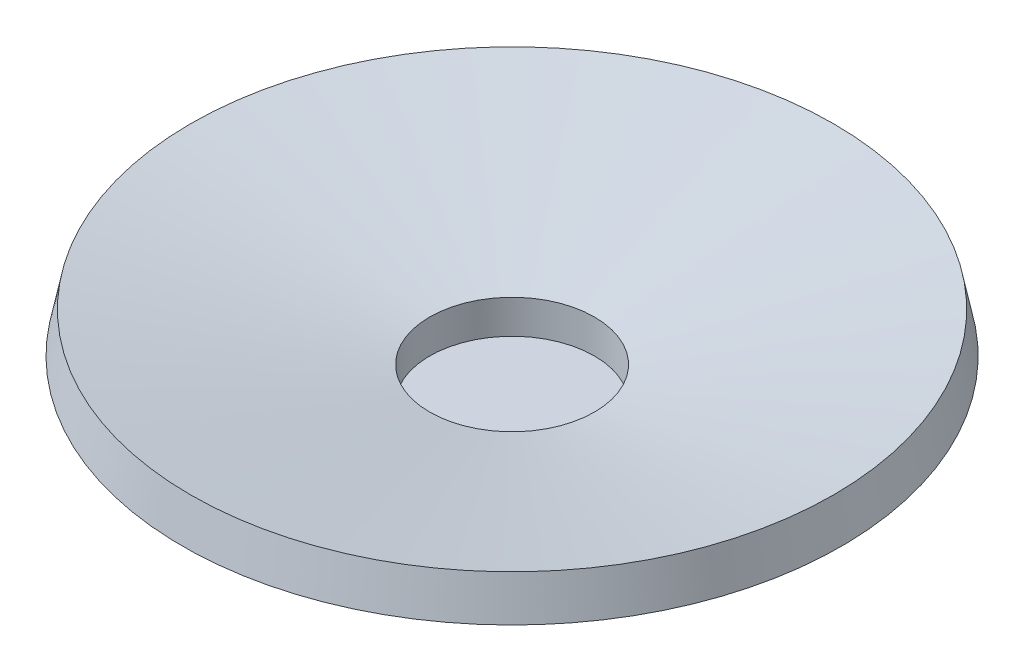
ISO-10303-21;
HEADER;
FILE_DESCRIPTION(('STEP AP214'),'2;1');
FILE_NAME('part.step','',(''),(''),'','','');
FILE_SCHEMA(('AUTOMOTIVE_DESIGN { 1 0 10303 214 1 1 1 1 }'));
ENDSEC;
DATA;
#1=APPLICATION_CONTEXT('core data for automotive mechanical design processes');
#2=APPLICATION_PROTOCOL_DEFINITION('international standard','automotive_design',2000,#1);
#3=PRODUCT_CONTEXT('',#1,'mechanical');
#4=PRODUCT('Part','Part','',(#3));
#5=PRODUCT_RELATED_PRODUCT_CATEGORY('part','',(#4));
#6=PRODUCT_DEFINITION_FORMATION('','',#4);
#7=PRODUCT_DEFINITION_CONTEXT('part definition',#1,'design');
#8=PRODUCT_DEFINITION('design','',#6,#7);
#9=PRODUCT_DEFINITION_SHAPE('','',#8);
#10=(LENGTH_UNIT() NAMED_UNIT(*) SI_UNIT(.MILLI.,.METRE.));
#11=(NAMED_UNIT(*) PLANE_ANGLE_UNIT() SI_UNIT($,.RADIAN.));
#12=(NAMED_UNIT(*) SI_UNIT($,.STERADIAN.) SOLID_ANGLE_UNIT());
#13=UNCERTAINTY_MEASURE_WITH_UNIT(LENGTH_MEASURE(1.E-05),#10,'distance_accuracy_value','');
#14=(GEOMETRIC_REPRESENTATION_CONTEXT(3) GLOBAL_UNCERTAINTY_ASSIGNED_CONTEXT((#13)) GLOBAL_UNIT_ASSIGNED_CONTEXT((#10,
#11,#12)) REPRESENTATION_CONTEXT('',''));
#15=CARTESIAN_POINT('',(0.,0.,0.));
#16=DIRECTION('',(0.,0.,1.));
#17=DIRECTION('',(1.,0.,0.));
#18=AXIS2_PLACEMENT_3D('',#15,#16,#17);
#19=CARTESIAN_POINT('',(0.,18.1980390271856,0.));
#20=DIRECTION('',(0.,1.,0.));
#21=DIRECTION('',(0.,0.,1.));
#22=AXIS2_PLACEMENT_3D('',#19,#20,#21);
#23=CONICAL_SURFACE('',#22,20.,1.37340076694502);
#24=CARTESIAN_POINT('',(0.,29.8058067569092,0.));
#25=DIRECTION('',(0.,-1.,0.));
#26=DIRECTION('',(0.,0.,-1.));
#27=AXIS2_PLACEMENT_3D('',#24,#25,#26);
#28=CIRCLE('',#27,78.0388386486182);
#29=CARTESIAN_POINT('',(0.,29.8058067569092,78.0388386486182));
#30=VERTEX_POINT('',#29);
#31=EDGE_CURVE('E58',#30,#30,#28,.T.);
#32=CARTESIAN_POINT('',(0.,18.1980390271856,0.));
#33=DIRECTION('',(0.,-1.,0.));
#34=DIRECTION('',(0.,0.,-1.));
#35=AXIS2_PLACEMENT_3D('',#32,#33,#34);
#36=CIRCLE('',#35,20.);
#37=CARTESIAN_POINT('',(0.,18.1980390271856,20.));
#38=VERTEX_POINT('',#37);
#39=EDGE_CURVE('E10',#38,#38,#36,.T.);
#40=CARTESIAN_POINT('',(0.,29.8058067569092,78.0388386486182));
#41=CARTESIAN_POINT('',(0.,29.6848925097246,77.4342674126951));
#42=CARTESIAN_POINT('',(0.,29.56397826254,76.829696176772));
#43=CARTESIAN_POINT('',(0.,29.3221497681707,75.6205537049258));
#44=CARTESIAN_POINT('',(0.,29.2012355209861,75.0159824690027));
#45=CARTESIAN_POINT('',(0.,28.9594070266169,73.8068399971565));
#46=CARTESIAN_POINT('',(0.,28.8384927794322,73.2022687612334));
#47=CARTESIAN_POINT('',(0.,28.596664285063,71.9931262893871));
#48=CARTESIAN_POINT('',(0.,28.4757500378784,71.388555053464));
#49=CARTESIAN_POINT('',(0.,28.2339215435091,70.1794125816178));
#50=CARTESIAN_POINT('',(0.,28.1130072963245,69.5748413456947));
#51=CARTESIAN_POINT('',(0.,27.8711788019553,68.3656988738485));
#52=CARTESIAN_POINT('',(0.,27.7502645547706,67.7611276379254));
#53=CARTESIAN_POINT('',(0.,27.5084360604014,66.5519851660792));
#54=CARTESIAN_POINT('',(0.,27.3875218132168,65.9474139301561));
#55=CARTESIAN_POINT('',(0.,27.1456933188475,64.7382714583099));
#56=CARTESIAN_POINT('',(0.,27.0247790716629,64.1337002223868));
#57=CARTESIAN_POINT('',(0.,26.7829505772937,62.9245577505405));
#58=CARTESIAN_POINT('',(0.,26.6620363301091,62.3199865146174));
#59=CARTESIAN_POINT('',(0.,26.4202078357398,61.1108440427712));
#60=CARTESIAN_POINT('',(0.,26.2992935885552,60.5062728068481));
#61=CARTESIAN_POINT('',(0.,26.057465094186,59.2971303350019));
#62=CARTESIAN_POINT('',(0.,25.9365508470013,58.6925590990788));
#63=CARTESIAN_POINT('',(0.,25.6947223526321,57.4834166272326));
#64=CARTESIAN_POINT('',(0.,25.5738081054475,56.8788453913095));
#65=CARTESIAN_POINT('',(0.,25.3319796110782,55.6697029194633));
#66=CARTESIAN_POINT('',(0.,25.2110653638936,55.0651316835402));
#67=CARTESIAN_POINT('',(0.,24.9692368695244,53.855989211694));
#68=CARTESIAN_POINT('',(0.,24.8483226223397,53.2514179757708));
#69=CARTESIAN_POINT('',(0.,24.6064941279705,52.0422755039246));
#70=CARTESIAN_POINT('',(0.,24.4855798807859,51.4377042680015));
#71=CARTESIAN_POINT('',(0.,24.2437513864166,50.2285617961553));
#72=CARTESIAN_POINT('',(0.,24.122837139232,49.6239905602322));
#73=CARTESIAN_POINT('',(0.,23.8810086448628,48.414848088386));
#74=CARTESIAN_POINT('',(0.,23.7600943976782,47.8102768524629));
#75=CARTESIAN_POINT('',(0.,23.5182659033089,46.6011343806167));
#76=CARTESIAN_POINT('',(0.,23.3973516561243,45.9965631446936));
#77=CARTESIAN_POINT('',(0.,23.155523161755,44.7874206728474));
#78=CARTESIAN_POINT('',(0.,23.0346089145704,44.1828494369243));
#79=CARTESIAN_POINT('',(0.,22.7927804202012,42.973706965078));
#80=CARTESIAN_POINT('',(0.,22.6718661730166,42.3691357291549));
#81=CARTESIAN_POINT('',(0.,22.4300376786473,41.1599932573087));
#82=CARTESIAN_POINT('',(0.,22.3091234314627,40.5554220213856));
#83=CARTESIAN_POINT('',(0.,22.0672949370935,39.3462795495394));
#84=CARTESIAN_POINT('',(0.,21.9463806899088,38.7417083136163));
#85=CARTESIAN_POINT('',(0.,21.7045521955396,37.5325658417701));
#86=CARTESIAN_POINT('',(0.,21.583637948355,36.927994605847));
#87=CARTESIAN_POINT('',(0.,21.3418094539857,35.7188521340008));
#88=CARTESIAN_POINT('',(0.,21.2208952068011,35.1142808980777));
#89=CARTESIAN_POINT('',(0.,20.9790667124319,33.9051384262314));
#90=CARTESIAN_POINT('',(0.,20.8581524652472,33.3005671903083));
#91=CARTESIAN_POINT('',(0.,20.616323970878,32.0914247184621));
#92=CARTESIAN_POINT('',(0.,20.4954097236934,31.486853482539));
#93=CARTESIAN_POINT('',(0.,20.2535812293241,30.2777110106928));
#94=CARTESIAN_POINT('',(0.,20.1326669821395,29.6731397747697));
#95=CARTESIAN_POINT('',(0.,19.8908384877703,28.4639973029235));
#96=CARTESIAN_POINT('',(0.,19.7699242405857,27.8594260670004));
#97=CARTESIAN_POINT('',(0.,19.5280957462164,26.6502835951542));
#98=CARTESIAN_POINT('',(0.,19.4071814990318,26.0457123592311));
#99=CARTESIAN_POINT('',(0.,19.1653530046625,24.8365698873849));
#100=CARTESIAN_POINT('',(0.,19.0444387574779,24.2319986514618));
#101=CARTESIAN_POINT('',(0.,18.8026102631087,23.0228561796155));
#102=CARTESIAN_POINT('',(0.,18.6816960159241,22.4182849436924));
#103=CARTESIAN_POINT('',(0.,18.4398675215548,21.2091424718462));
#104=CARTESIAN_POINT('',(0.,18.3189532743702,20.6045712359231));
#105=CARTESIAN_POINT('',(0.,18.1980390271856,20.));
#106=B_SPLINE_CURVE_WITH_KNOTS('',3,(#40,#41,#42,#43,#44,#45,#46,#47,#48,#49,#50,#51,#52,#53,
#54,#55,#56,#57,#58,#59,#60,#61,#62,#63,#64,#65,#66,#67,#68,#69,#70,#71,#72,#73,#74,#75,#76,#77,
#78,#79,#80,#81,#82,#83,#84,#85,#86,#87,#88,#89,#90,#91,#92,#93,#94,#95,#96,#97,#98,#99,#100,
#101,#102,#103,#104,#105),.UNSPECIFIED.,.F.,.F.,(4,2,2,2,2,2,2,2,2,2,2,2,2,2,2,2,2,2,2,2,2,2,2,
2,2,2,2,2,2,2,2,2,4),(0.,1.8496323175973,3.69926463519459,5.54889695279189,7.39852927038917,
9.24816158798648,11.0977939055838,12.9474262231811,14.7970585407784,16.6466908583757,
18.496323175973,20.3459554935703,22.1955878111675,24.0452201287648,25.8948524463621,
27.7444847639594,29.5941170815567,31.443749399154,33.2933817167513,35.1430140343486,
36.9926463519459,38.8422786695432,40.6919109871405,42.5415433047378,44.3911756223351,
46.2408079399324,48.0904402575297,49.940072575127,51.7897048927243,53.6393372103216,
55.4889695279189,57.3386018455161,59.1882341631134),.UNSPECIFIED.);
#107=EDGE_CURVE('BSEAM36',#30,#38,#106,.T.);
#108=ORIENTED_EDGE('',*,*,#31,.F.);
#109=ORIENTED_EDGE('',*,*,#39,.T.);
#110=ORIENTED_EDGE('',*,*,#107,.T.);
#111=ORIENTED_EDGE('',*,*,#107,.F.);
#112=EDGE_LOOP('',(#108,#110,#109,#111));
#113=FACE_BOUND('',#112,.T.);
#114=ADVANCED_FACE('F36',(#113),#23,.F.);
#115=CARTESIAN_POINT('',(0.,0.,0.));
#116=DIRECTION('',(0.,-1.,0.));
#117=DIRECTION('',(0.,0.,-1.));
#118=AXIS2_PLACEMENT_3D('',#115,#116,#117);
#119=CYLINDRICAL_SURFACE('',#118,20.);
#120=ORIENTED_EDGE('',*,*,#39,.F.);
#121=EDGE_LOOP('',(#120));
#122=FACE_BOUND('',#121,.T.);
#123=CARTESIAN_POINT('',(0.,10.,0.));
#124=DIRECTION('',(0.,-1.,0.));
#125=DIRECTION('',(0.,0.,-1.));
#126=AXIS2_PLACEMENT_3D('',#123,#124,#125);
#127=CIRCLE('',#126,20.);
#128=CARTESIAN_POINT('',(0.,10.,-20.));
#129=VERTEX_POINT('',#128);
#130=EDGE_CURVE('E42',#129,#129,#127,.T.);
#131=ORIENTED_EDGE('',*,*,#130,.T.);
#132=EDGE_LOOP('',(#131));
#133=FACE_BOUND('',#132,.T.);
#134=ADVANCED_FACE('F66',(#122,#133),#119,.F.);
#135=CARTESIAN_POINT('',(0.,10.,0.));
#136=DIRECTION('',(0.,-1.,0.));
#137=DIRECTION('',(0.,0.,-1.));
#138=AXIS2_PLACEMENT_3D('',#135,#136,#137);
#139=PLANE('',#138);
#140=ORIENTED_EDGE('',*,*,#130,.F.);
#141=EDGE_LOOP('',(#140));
#142=FACE_BOUND('',#141,.T.);
#143=ADVANCED_FACE('F70',(#142),#139,.F.);
#144=CARTESIAN_POINT('',(0.,0.,0.));
#145=DIRECTION('',(0.,-1.,0.));
#146=DIRECTION('',(0.,0.,-1.));
#147=AXIS2_PLACEMENT_3D('',#144,#145,#146);
#148=PLANE('',#147);
#149=CARTESIAN_POINT('',(0.,0.,0.));
#150=DIRECTION('',(0.,-1.,0.));
#151=DIRECTION('',(0.,0.,-1.));
#152=AXIS2_PLACEMENT_3D('',#149,#150,#151);
#153=CIRCLE('',#152,30.);
#154=CARTESIAN_POINT('',(0.,0.,-30.));
#155=VERTEX_POINT('',#154);
#156=EDGE_CURVE('E46',#155,#155,#153,.T.);
#157=ORIENTED_EDGE('',*,*,#156,.T.);
#158=EDGE_LOOP('',(#157));
#159=FACE_BOUND('',#158,.T.);
#160=ADVANCED_FACE('F75',(#159),#148,.T.);
#161=CARTESIAN_POINT('',(0.,0.,0.));
#162=DIRECTION('',(0.,-1.,0.));
#163=DIRECTION('',(0.,0.,-1.));
#164=AXIS2_PLACEMENT_3D('',#161,#162,#163);
#165=CYLINDRICAL_SURFACE('',#164,30.);
#166=CARTESIAN_POINT('',(0.,10.,0.));
#167=DIRECTION('',(0.,-1.,0.));
#168=DIRECTION('',(0.,0.,-1.));
#169=AXIS2_PLACEMENT_3D('',#166,#167,#168);
#170=CIRCLE('',#169,30.);
#171=CARTESIAN_POINT('',(0.,10.,-30.));
#172=VERTEX_POINT('',#171);
#173=EDGE_CURVE('E50',#172,#172,#170,.T.);
#174=ORIENTED_EDGE('',*,*,#173,.T.);
#175=EDGE_LOOP('',(#174));
#176=FACE_BOUND('',#175,.T.);
#177=ORIENTED_EDGE('',*,*,#156,.F.);
#178=EDGE_LOOP('',(#177));
#179=FACE_BOUND('',#178,.T.);
#180=ADVANCED_FACE('F81',(#176,#179),#165,.T.);
#181=CARTESIAN_POINT('',(0.,10.,0.));
#182=DIRECTION('',(0.,1.,0.));
#183=DIRECTION('',(0.,0.,1.));
#184=AXIS2_PLACEMENT_3D('',#181,#182,#183);
#185=CONICAL_SURFACE('',#184,30.,1.37340076694502);
#186=CARTESIAN_POINT('',(0.,20.,0.));
#187=DIRECTION('',(0.,-1.,0.));
#188=DIRECTION('',(0.,0.,-1.));
#189=AXIS2_PLACEMENT_3D('',#186,#187,#188);
#190=CIRCLE('',#189,80.);
#191=CARTESIAN_POINT('',(0.,20.,-80.));
#192=VERTEX_POINT('',#191);
#193=EDGE_CURVE('E55',#192,#192,#190,.T.);
#194=ORIENTED_EDGE('',*,*,#193,.T.);
#195=EDGE_LOOP('',(#194));
#196=FACE_BOUND('',#195,.T.);
#197=ORIENTED_EDGE('',*,*,#173,.F.);
#198=EDGE_LOOP('',(#197));
#199=FACE_BOUND('',#198,.T.);
#200=ADVANCED_FACE('F85',(#196,#199),#185,.T.);
#201=CARTESIAN_POINT('',(0.,20.,0.));
#202=DIRECTION('',(0.,-1.,0.));
#203=DIRECTION('',(0.,0.,-1.));
#204=AXIS2_PLACEMENT_3D('',#201,#202,#203);
#205=CONICAL_SURFACE('',#204,80.,0.19739555984988);
#206=ORIENTED_EDGE('',*,*,#31,.T.);
#207=EDGE_LOOP('',(#206));
#208=FACE_BOUND('',#207,.T.);
#209=ORIENTED_EDGE('',*,*,#193,.F.);
#210=EDGE_LOOP('',(#209));
#211=FACE_BOUND('',#210,.T.);
#212=ADVANCED_FACE('F62',(#208,#211),#205,.T.);
#213=CLOSED_SHELL('',(#114,#134,#143,#160,#180,#200,#212));
#214=MANIFOLD_SOLID_BREP('B2',#213);
#215=ADVANCED_BREP_SHAPE_REPRESENTATION('',(#18,#214),#14);
#216=SHAPE_DEFINITION_REPRESENTATION(#9,#215);
ENDSEC;
END-ISO-10303-21;
